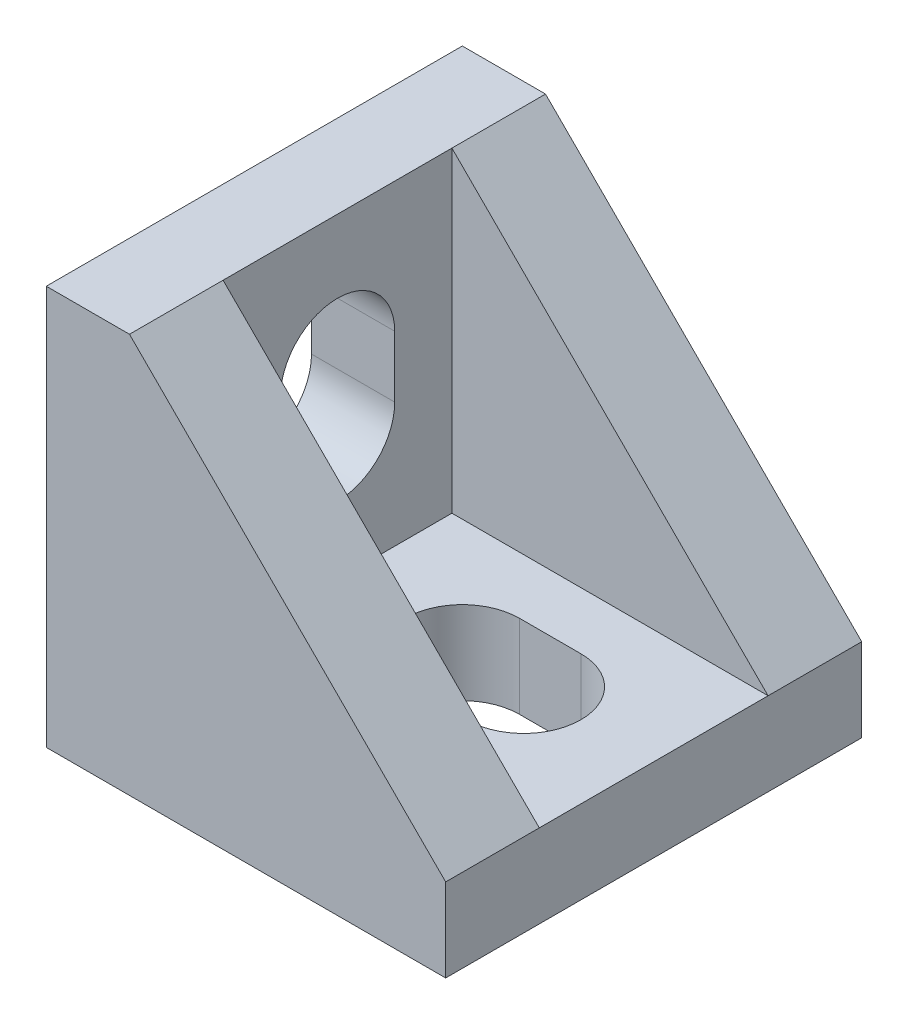
ISO-10303-21;
HEADER;
FILE_DESCRIPTION(('STEP AP214'),'2;1');
FILE_NAME('part.step','',(''),(''),'','','');
FILE_SCHEMA(('AUTOMOTIVE_DESIGN { 1 0 10303 214 1 1 1 1 }'));
ENDSEC;
DATA;
#1=APPLICATION_CONTEXT('core data for automotive mechanical design processes');
#2=APPLICATION_PROTOCOL_DEFINITION('international standard','automotive_design',2000,#1);
#3=PRODUCT_CONTEXT('',#1,'mechanical');
#4=PRODUCT('Part','Part','',(#3));
#5=PRODUCT_RELATED_PRODUCT_CATEGORY('part','',(#4));
#6=PRODUCT_DEFINITION_FORMATION('','',#4);
#7=PRODUCT_DEFINITION_CONTEXT('part definition',#1,'design');
#8=PRODUCT_DEFINITION('design','',#6,#7);
#9=PRODUCT_DEFINITION_SHAPE('','',#8);
#10=(LENGTH_UNIT() NAMED_UNIT(*) SI_UNIT(.MILLI.,.METRE.));
#11=(NAMED_UNIT(*) PLANE_ANGLE_UNIT() SI_UNIT($,.RADIAN.));
#12=(NAMED_UNIT(*) SI_UNIT($,.STERADIAN.) SOLID_ANGLE_UNIT());
#13=UNCERTAINTY_MEASURE_WITH_UNIT(LENGTH_MEASURE(1.E-05),#10,'distance_accuracy_value','');
#14=(GEOMETRIC_REPRESENTATION_CONTEXT(3) GLOBAL_UNCERTAINTY_ASSIGNED_CONTEXT((#13)) GLOBAL_UNIT_ASSIGNED_CONTEXT((#10,
#11,#12)) REPRESENTATION_CONTEXT('',''));
#15=CARTESIAN_POINT('',(0.,0.,0.));
#16=DIRECTION('',(0.,0.,1.));
#17=DIRECTION('',(1.,0.,0.));
#18=AXIS2_PLACEMENT_3D('',#15,#16,#17);
#19=CARTESIAN_POINT('',(0.,0.,4.5));
#20=DIRECTION('',(0.,0.,-1.));
#21=DIRECTION('',(-1.,0.,0.));
#22=AXIS2_PLACEMENT_3D('',#19,#20,#21);
#23=PLANE('',#22);
#24=DIRECTION('',(0.,1.,0.));
#25=VECTOR('',#24,1.);
#26=CARTESIAN_POINT('',(4.,19.2,4.5));
#27=LINE('',#26,#25);
#28=CARTESIAN_POINT('',(4.,4.,4.5));
#29=VERTEX_POINT('',#28);
#30=CARTESIAN_POINT('',(4.,19.2,4.5));
#31=VERTEX_POINT('',#30);
#32=EDGE_CURVE('E11',#29,#31,#27,.T.);
#33=ORIENTED_EDGE('',*,*,#32,.F.);
#34=DIRECTION('',(1.,0.,0.));
#35=VECTOR('',#34,1.);
#36=CARTESIAN_POINT('',(19.2,3.99999999999999,4.5));
#37=LINE('',#36,#35);
#38=CARTESIAN_POINT('',(19.2,3.99999999999999,4.5));
#39=VERTEX_POINT('',#38);
#40=EDGE_CURVE('E199',#29,#39,#37,.T.);
#41=ORIENTED_EDGE('',*,*,#40,.T.);
#42=DIRECTION('',(-0.707106781186547,0.707106781186548,0.));
#43=VECTOR('',#42,1.);
#44=CARTESIAN_POINT('',(4.,19.2,4.5));
#45=LINE('',#44,#43);
#46=EDGE_CURVE('E267',#39,#31,#45,.T.);
#47=ORIENTED_EDGE('',*,*,#46,.T.);
#48=EDGE_LOOP('',(#33,#41,#47));
#49=FACE_BOUND('',#48,.T.);
#50=ADVANCED_FACE('F39',(#49),#23,.F.);
#51=CARTESIAN_POINT('',(4.,19.2,4.5));
#52=DIRECTION('',(-0.707106781186548,-0.707106781186547,0.));
#53=DIRECTION('',(0.707106781186547,-0.707106781186548,0.));
#54=AXIS2_PLACEMENT_3D('',#51,#52,#53);
#55=PLANE('',#54);
#56=DIRECTION('',(-0.707106781186547,0.707106781186548,0.));
#57=VECTOR('',#56,1.);
#58=CARTESIAN_POINT('',(4.,19.2,0.));
#59=LINE('',#58,#57);
#60=CARTESIAN_POINT('',(19.2,3.99999999999999,0.));
#61=VERTEX_POINT('',#60);
#62=CARTESIAN_POINT('',(4.,19.2,0.));
#63=VERTEX_POINT('',#62);
#64=EDGE_CURVE('E266',#61,#63,#59,.T.);
#65=ORIENTED_EDGE('',*,*,#64,.T.);
#66=DIRECTION('',(0.,0.,-1.));
#67=VECTOR('',#66,1.);
#68=CARTESIAN_POINT('',(4.,19.2,4.5));
#69=LINE('',#68,#67);
#70=EDGE_CURVE('E43',#31,#63,#69,.T.);
#71=ORIENTED_EDGE('',*,*,#70,.F.);
#72=ORIENTED_EDGE('',*,*,#46,.F.);
#73=DIRECTION('',(0.,0.,-1.));
#74=VECTOR('',#73,1.);
#75=CARTESIAN_POINT('',(19.2,3.99999999999999,4.5));
#76=LINE('',#75,#74);
#77=EDGE_CURVE('E187',#39,#61,#76,.T.);
#78=ORIENTED_EDGE('',*,*,#77,.T.);
#79=EDGE_LOOP('',(#65,#71,#72,#78));
#80=FACE_BOUND('',#79,.T.);
#81=ADVANCED_FACE('F41',(#80),#55,.F.);
#82=CARTESIAN_POINT('',(0.,19.2,4.5));
#83=DIRECTION('',(0.,-1.,0.));
#84=DIRECTION('',(0.,0.,-1.));
#85=AXIS2_PLACEMENT_3D('',#82,#83,#84);
#86=PLANE('',#85);
#87=DIRECTION('',(-1.,0.,0.));
#88=VECTOR('',#87,1.);
#89=CARTESIAN_POINT('',(0.,19.2,0.));
#90=LINE('',#89,#88);
#91=CARTESIAN_POINT('',(0.,19.2,0.));
#92=VERTEX_POINT('',#91);
#93=EDGE_CURVE('E273',#63,#92,#90,.T.);
#94=ORIENTED_EDGE('',*,*,#93,.T.);
#95=DIRECTION('',(0.,0.,-1.));
#96=VECTOR('',#95,1.);
#97=CARTESIAN_POINT('',(0.,19.2,4.5));
#98=LINE('',#97,#96);
#99=CARTESIAN_POINT('',(0.,19.2,20.));
#100=VERTEX_POINT('',#99);
#101=EDGE_CURVE('E270',#100,#92,#98,.T.);
#102=ORIENTED_EDGE('',*,*,#101,.F.);
#103=DIRECTION('',(-1.,0.,0.));
#104=VECTOR('',#103,1.);
#105=CARTESIAN_POINT('',(0.,19.2,20.));
#106=LINE('',#105,#104);
#107=CARTESIAN_POINT('',(4.,19.2,20.));
#108=VERTEX_POINT('',#107);
#109=EDGE_CURVE('E240',#108,#100,#106,.T.);
#110=ORIENTED_EDGE('',*,*,#109,.F.);
#111=DIRECTION('',(0.,0.,1.));
#112=VECTOR('',#111,1.);
#113=CARTESIAN_POINT('',(4.,19.2,15.5));
#114=LINE('',#113,#112);
#115=CARTESIAN_POINT('',(4.,19.2,15.5));
#116=VERTEX_POINT('',#115);
#117=EDGE_CURVE('E162',#116,#108,#114,.T.);
#118=ORIENTED_EDGE('',*,*,#117,.F.);
#119=DIRECTION('',(0.,0.,1.));
#120=VECTOR('',#119,1.);
#121=CARTESIAN_POINT('',(4.,19.2,4.5));
#122=LINE('',#121,#120);
#123=EDGE_CURVE('E246',#31,#116,#122,.T.);
#124=ORIENTED_EDGE('',*,*,#123,.F.);
#125=ORIENTED_EDGE('',*,*,#70,.T.);
#126=EDGE_LOOP('',(#94,#102,#110,#118,#124,#125));
#127=FACE_BOUND('',#126,.T.);
#128=ADVANCED_FACE('F283',(#127),#86,.F.);
#129=CARTESIAN_POINT('',(0.,0.,4.5));
#130=DIRECTION('',(1.,0.,0.));
#131=DIRECTION('',(0.,0.,-1.));
#132=AXIS2_PLACEMENT_3D('',#129,#130,#131);
#133=PLANE('',#132);
#134=DIRECTION('',(0.,0.,-1.));
#135=VECTOR('',#134,1.);
#136=CARTESIAN_POINT('',(0.,0.,10.));
#137=LINE('',#136,#135);
#138=CARTESIAN_POINT('',(0.,0.,20.));
#139=VERTEX_POINT('',#138);
#140=CARTESIAN_POINT('',(0.,0.,0.));
#141=VERTEX_POINT('',#140);
#142=EDGE_CURVE('E62',#139,#141,#137,.T.);
#143=ORIENTED_EDGE('',*,*,#142,.F.);
#144=DIRECTION('',(0.,-1.,0.));
#145=VECTOR('',#144,1.);
#146=CARTESIAN_POINT('',(0.,0.,20.));
#147=LINE('',#146,#145);
#148=EDGE_CURVE('E163',#100,#139,#147,.T.);
#149=ORIENTED_EDGE('',*,*,#148,.F.);
#150=ORIENTED_EDGE('',*,*,#101,.T.);
#151=DIRECTION('',(0.,-1.,0.));
#152=VECTOR('',#151,1.);
#153=CARTESIAN_POINT('',(0.,0.,0.));
#154=LINE('',#153,#152);
#155=EDGE_CURVE('E271',#92,#141,#154,.T.);
#156=ORIENTED_EDGE('',*,*,#155,.T.);
#157=EDGE_LOOP('',(#143,#149,#150,#156));
#158=FACE_BOUND('',#157,.T.);
#159=CARTESIAN_POINT('',(0.,12.95,10.));
#160=DIRECTION('',(-1.,0.,0.));
#161=DIRECTION('',(0.,0.,1.));
#162=AXIS2_PLACEMENT_3D('',#159,#160,#161);
#163=CIRCLE('',#162,2.75);
#164=CARTESIAN_POINT('',(0.,12.95,12.75));
#165=VERTEX_POINT('',#164);
#166=CARTESIAN_POINT('',(0.,12.95,7.25));
#167=VERTEX_POINT('',#166);
#168=EDGE_CURVE('E227',#165,#167,#163,.T.);
#169=ORIENTED_EDGE('',*,*,#168,.F.);
#170=DIRECTION('',(0.,-1.,0.));
#171=VECTOR('',#170,1.);
#172=CARTESIAN_POINT('',(0.,12.95,12.75));
#173=LINE('',#172,#171);
#174=CARTESIAN_POINT('',(0.,10.,12.75));
#175=VERTEX_POINT('',#174);
#176=EDGE_CURVE('E225',#165,#175,#173,.T.);
#177=ORIENTED_EDGE('',*,*,#176,.T.);
#178=CARTESIAN_POINT('',(0.,10.,9.99999999999999));
#179=DIRECTION('',(-1.,0.,0.));
#180=DIRECTION('',(0.,0.,-1.));
#181=AXIS2_PLACEMENT_3D('',#178,#179,#180);
#182=CIRCLE('',#181,2.75);
#183=CARTESIAN_POINT('',(0.,10.,7.25));
#184=VERTEX_POINT('',#183);
#185=EDGE_CURVE('E258',#184,#175,#182,.T.);
#186=ORIENTED_EDGE('',*,*,#185,.F.);
#187=DIRECTION('',(0.,-1.,0.));
#188=VECTOR('',#187,1.);
#189=CARTESIAN_POINT('',(0.,12.95,7.25));
#190=LINE('',#189,#188);
#191=EDGE_CURVE('E256',#167,#184,#190,.T.);
#192=ORIENTED_EDGE('',*,*,#191,.F.);
#193=EDGE_LOOP('',(#169,#177,#186,#192));
#194=FACE_BOUND('',#193,.T.);
#195=ADVANCED_FACE('F288',(#158,#194),#133,.F.);
#196=CARTESIAN_POINT('',(0.,0.,0.));
#197=DIRECTION('',(0.,0.,-1.));
#198=DIRECTION('',(-1.,0.,0.));
#199=AXIS2_PLACEMENT_3D('',#196,#197,#198);
#200=PLANE('',#199);
#201=ORIENTED_EDGE('',*,*,#64,.F.);
#202=DIRECTION('',(0.,-1.,0.));
#203=VECTOR('',#202,1.);
#204=CARTESIAN_POINT('',(19.2,0.,0.));
#205=LINE('',#204,#203);
#206=CARTESIAN_POINT('',(19.2,0.,0.));
#207=VERTEX_POINT('',#206);
#208=EDGE_CURVE('E214',#61,#207,#205,.T.);
#209=ORIENTED_EDGE('',*,*,#208,.T.);
#210=DIRECTION('',(-1.,0.,0.));
#211=VECTOR('',#210,1.);
#212=CARTESIAN_POINT('',(0.,0.,0.));
#213=LINE('',#212,#211);
#214=EDGE_CURVE('E217',#207,#141,#213,.T.);
#215=ORIENTED_EDGE('',*,*,#214,.T.);
#216=ORIENTED_EDGE('',*,*,#155,.F.);
#217=ORIENTED_EDGE('',*,*,#93,.F.);
#218=EDGE_LOOP('',(#201,#209,#215,#216,#217));
#219=FACE_BOUND('',#218,.T.);
#220=ADVANCED_FACE('F287',(#219),#200,.T.);
#221=CARTESIAN_POINT('',(4.,12.95,10.));
#222=DIRECTION('',(-1.,0.,0.));
#223=DIRECTION('',(0.,0.,1.));
#224=AXIS2_PLACEMENT_3D('',#221,#222,#223);
#225=CYLINDRICAL_SURFACE('',#224,2.75);
#226=ORIENTED_EDGE('',*,*,#168,.T.);
#227=DIRECTION('',(-1.,0.,0.));
#228=VECTOR('',#227,1.);
#229=CARTESIAN_POINT('',(4.,12.95,7.25));
#230=LINE('',#229,#228);
#231=CARTESIAN_POINT('',(4.,12.95,7.25));
#232=VERTEX_POINT('',#231);
#233=EDGE_CURVE('E263',#232,#167,#230,.T.);
#234=ORIENTED_EDGE('',*,*,#233,.F.);
#235=CARTESIAN_POINT('',(4.,12.95,10.));
#236=DIRECTION('',(-1.,0.,0.));
#237=DIRECTION('',(0.,0.,1.));
#238=AXIS2_PLACEMENT_3D('',#235,#236,#237);
#239=CIRCLE('',#238,2.75);
#240=CARTESIAN_POINT('',(4.,12.95,12.75));
#241=VERTEX_POINT('',#240);
#242=EDGE_CURVE('E248',#241,#232,#239,.T.);
#243=ORIENTED_EDGE('',*,*,#242,.F.);
#244=DIRECTION('',(-1.,0.,0.));
#245=VECTOR('',#244,1.);
#246=CARTESIAN_POINT('',(4.,12.95,12.75));
#247=LINE('',#246,#245);
#248=EDGE_CURVE('E236',#241,#165,#247,.T.);
#249=ORIENTED_EDGE('',*,*,#248,.T.);
#250=EDGE_LOOP('',(#226,#234,#243,#249));
#251=FACE_BOUND('',#250,.T.);
#252=ADVANCED_FACE('F347',(#251),#225,.F.);
#253=CARTESIAN_POINT('',(4.,12.95,7.25));
#254=DIRECTION('',(0.,0.,-1.));
#255=DIRECTION('',(0.,1.,0.));
#256=AXIS2_PLACEMENT_3D('',#253,#254,#255);
#257=PLANE('',#256);
#258=ORIENTED_EDGE('',*,*,#191,.T.);
#259=DIRECTION('',(-1.,0.,0.));
#260=VECTOR('',#259,1.);
#261=CARTESIAN_POINT('',(4.,10.,7.25));
#262=LINE('',#261,#260);
#263=CARTESIAN_POINT('',(4.,10.,7.25));
#264=VERTEX_POINT('',#263);
#265=EDGE_CURVE('E254',#264,#184,#262,.T.);
#266=ORIENTED_EDGE('',*,*,#265,.F.);
#267=DIRECTION('',(0.,-1.,0.));
#268=VECTOR('',#267,1.);
#269=CARTESIAN_POINT('',(4.,12.95,7.25));
#270=LINE('',#269,#268);
#271=EDGE_CURVE('E250',#232,#264,#270,.T.);
#272=ORIENTED_EDGE('',*,*,#271,.F.);
#273=ORIENTED_EDGE('',*,*,#233,.T.);
#274=EDGE_LOOP('',(#258,#266,#272,#273));
#275=FACE_BOUND('',#274,.T.);
#276=ADVANCED_FACE('F335',(#275),#257,.F.);
#277=CARTESIAN_POINT('',(4.,10.,9.99999999999999));
#278=DIRECTION('',(-1.,0.,0.));
#279=DIRECTION('',(0.,0.,1.));
#280=AXIS2_PLACEMENT_3D('',#277,#278,#279);
#281=CYLINDRICAL_SURFACE('',#280,2.75);
#282=ORIENTED_EDGE('',*,*,#185,.T.);
#283=DIRECTION('',(-1.,0.,0.));
#284=VECTOR('',#283,1.);
#285=CARTESIAN_POINT('',(4.,10.,12.75));
#286=LINE('',#285,#284);
#287=CARTESIAN_POINT('',(4.,10.,12.75));
#288=VERTEX_POINT('',#287);
#289=EDGE_CURVE('E231',#288,#175,#286,.T.);
#290=ORIENTED_EDGE('',*,*,#289,.F.);
#291=CARTESIAN_POINT('',(4.,10.,9.99999999999999));
#292=DIRECTION('',(-1.,0.,0.));
#293=DIRECTION('',(0.,0.,-1.));
#294=AXIS2_PLACEMENT_3D('',#291,#292,#293);
#295=CIRCLE('',#294,2.75);
#296=EDGE_CURVE('E252',#264,#288,#295,.T.);
#297=ORIENTED_EDGE('',*,*,#296,.F.);
#298=ORIENTED_EDGE('',*,*,#265,.T.);
#299=EDGE_LOOP('',(#282,#290,#297,#298));
#300=FACE_BOUND('',#299,.T.);
#301=ADVANCED_FACE('F327',(#300),#281,.F.);
#302=CARTESIAN_POINT('',(4.,0.,10.));
#303=DIRECTION('',(0.,1.,0.));
#304=DIRECTION('',(0.,0.,1.));
#305=AXIS2_PLACEMENT_3D('',#302,#303,#304);
#306=PLANE('',#305);
#307=ORIENTED_EDGE('',*,*,#142,.T.);
#308=ORIENTED_EDGE('',*,*,#214,.F.);
#309=DIRECTION('',(0.,0.,-1.));
#310=VECTOR('',#309,1.);
#311=CARTESIAN_POINT('',(19.2,0.,4.5));
#312=LINE('',#311,#310);
#313=CARTESIAN_POINT('',(19.2,0.,20.));
#314=VERTEX_POINT('',#313);
#315=EDGE_CURVE('E220',#314,#207,#312,.T.);
#316=ORIENTED_EDGE('',*,*,#315,.F.);
#317=DIRECTION('',(-1.,0.,0.));
#318=VECTOR('',#317,1.);
#319=CARTESIAN_POINT('',(0.,0.,20.));
#320=LINE('',#319,#318);
#321=EDGE_CURVE('E182',#314,#139,#320,.T.);
#322=ORIENTED_EDGE('',*,*,#321,.T.);
#323=EDGE_LOOP('',(#307,#308,#316,#322));
#324=FACE_BOUND('',#323,.T.);
#325=CARTESIAN_POINT('',(12.95,0.,10.));
#326=DIRECTION('',(0.,1.,0.));
#327=DIRECTION('',(0.,0.,1.));
#328=AXIS2_PLACEMENT_3D('',#325,#326,#327);
#329=CIRCLE('',#328,2.75);
#330=CARTESIAN_POINT('',(12.95,0.,12.75));
#331=VERTEX_POINT('',#330);
#332=CARTESIAN_POINT('',(12.95,0.,7.25));
#333=VERTEX_POINT('',#332);
#334=EDGE_CURVE('E172',#331,#333,#329,.T.);
#335=ORIENTED_EDGE('',*,*,#334,.T.);
#336=DIRECTION('',(-1.,0.,0.));
#337=VECTOR('',#336,1.);
#338=CARTESIAN_POINT('',(12.95,0.,7.25));
#339=LINE('',#338,#337);
#340=CARTESIAN_POINT('',(10.,0.,7.25));
#341=VERTEX_POINT('',#340);
#342=EDGE_CURVE('E196',#333,#341,#339,.T.);
#343=ORIENTED_EDGE('',*,*,#342,.T.);
#344=CARTESIAN_POINT('',(10.,0.,9.99999999999999));
#345=DIRECTION('',(0.,1.,0.));
#346=DIRECTION('',(0.,0.,-1.));
#347=AXIS2_PLACEMENT_3D('',#344,#345,#346);
#348=CIRCLE('',#347,2.75);
#349=CARTESIAN_POINT('',(10.,0.,12.75));
#350=VERTEX_POINT('',#349);
#351=EDGE_CURVE('E190',#341,#350,#348,.T.);
#352=ORIENTED_EDGE('',*,*,#351,.T.);
#353=DIRECTION('',(-1.,0.,0.));
#354=VECTOR('',#353,1.);
#355=CARTESIAN_POINT('',(12.95,0.,12.75));
#356=LINE('',#355,#354);
#357=EDGE_CURVE('E304',#331,#350,#356,.T.);
#358=ORIENTED_EDGE('',*,*,#357,.F.);
#359=EDGE_LOOP('',(#335,#343,#352,#358));
#360=FACE_BOUND('',#359,.T.);
#361=ADVANCED_FACE('F293',(#324,#360),#306,.F.);
#362=CARTESIAN_POINT('',(4.,10.,9.99999999999999));
#363=DIRECTION('',(1.,0.,0.));
#364=DIRECTION('',(0.,0.,-1.));
#365=AXIS2_PLACEMENT_3D('',#362,#363,#364);
#366=PLANE('',#365);
#367=DIRECTION('',(0.,0.,1.));
#368=VECTOR('',#367,1.);
#369=CARTESIAN_POINT('',(4.,4.,9.99999999999999));
#370=LINE('',#369,#368);
#371=CARTESIAN_POINT('',(4.,4.,15.5));
#372=VERTEX_POINT('',#371);
#373=EDGE_CURVE('E54',#29,#372,#370,.T.);
#374=ORIENTED_EDGE('',*,*,#373,.F.);
#375=ORIENTED_EDGE('',*,*,#32,.T.);
#376=ORIENTED_EDGE('',*,*,#123,.T.);
#377=DIRECTION('',(0.,1.,0.));
#378=VECTOR('',#377,1.);
#379=CARTESIAN_POINT('',(4.,19.2,15.5));
#380=LINE('',#379,#378);
#381=EDGE_CURVE('E158',#372,#116,#380,.T.);
#382=ORIENTED_EDGE('',*,*,#381,.F.);
#383=EDGE_LOOP('',(#374,#375,#376,#382));
#384=FACE_BOUND('',#383,.T.);
#385=DIRECTION('',(0.,-1.,0.));
#386=VECTOR('',#385,1.);
#387=CARTESIAN_POINT('',(4.,12.95,12.75));
#388=LINE('',#387,#386);
#389=EDGE_CURVE('E228',#241,#288,#388,.T.);
#390=ORIENTED_EDGE('',*,*,#389,.F.);
#391=ORIENTED_EDGE('',*,*,#242,.T.);
#392=ORIENTED_EDGE('',*,*,#271,.T.);
#393=ORIENTED_EDGE('',*,*,#296,.T.);
#394=EDGE_LOOP('',(#390,#391,#392,#393));
#395=FACE_BOUND('',#394,.T.);
#396=ADVANCED_FACE('F326',(#384,#395),#366,.T.);
#397=CARTESIAN_POINT('',(0.,0.,15.5));
#398=DIRECTION('',(0.,0.,1.));
#399=DIRECTION('',(-1.,0.,0.));
#400=AXIS2_PLACEMENT_3D('',#397,#398,#399);
#401=PLANE('',#400);
#402=ORIENTED_EDGE('',*,*,#381,.T.);
#403=DIRECTION('',(-0.707106781186547,0.707106781186548,0.));
#404=VECTOR('',#403,1.);
#405=CARTESIAN_POINT('',(4.,19.2,15.5));
#406=LINE('',#405,#404);
#407=CARTESIAN_POINT('',(19.2,3.99999999999999,15.5));
#408=VERTEX_POINT('',#407);
#409=EDGE_CURVE('E154',#408,#116,#406,.T.);
#410=ORIENTED_EDGE('',*,*,#409,.F.);
#411=DIRECTION('',(1.,0.,0.));
#412=VECTOR('',#411,1.);
#413=CARTESIAN_POINT('',(19.2,3.99999999999999,15.5));
#414=LINE('',#413,#412);
#415=EDGE_CURVE('E157',#372,#408,#414,.T.);
#416=ORIENTED_EDGE('',*,*,#415,.F.);
#417=EDGE_LOOP('',(#402,#410,#416));
#418=FACE_BOUND('',#417,.T.);
#419=ADVANCED_FACE('F156',(#418),#401,.F.);
#420=CARTESIAN_POINT('',(4.,19.2,15.5));
#421=DIRECTION('',(-0.707106781186548,-0.707106781186547,0.));
#422=DIRECTION('',(0.707106781186547,-0.707106781186548,0.));
#423=AXIS2_PLACEMENT_3D('',#420,#421,#422);
#424=PLANE('',#423);
#425=DIRECTION('',(-0.707106781186547,0.707106781186548,0.));
#426=VECTOR('',#425,1.);
#427=CARTESIAN_POINT('',(4.,19.2,20.));
#428=LINE('',#427,#426);
#429=CARTESIAN_POINT('',(19.2,3.99999999999999,20.));
#430=VERTEX_POINT('',#429);
#431=EDGE_CURVE('E178',#430,#108,#428,.T.);
#432=ORIENTED_EDGE('',*,*,#431,.F.);
#433=DIRECTION('',(0.,0.,1.));
#434=VECTOR('',#433,1.);
#435=CARTESIAN_POINT('',(19.2,3.99999999999999,15.5));
#436=LINE('',#435,#434);
#437=EDGE_CURVE('E173',#408,#430,#436,.T.);
#438=ORIENTED_EDGE('',*,*,#437,.F.);
#439=ORIENTED_EDGE('',*,*,#409,.T.);
#440=ORIENTED_EDGE('',*,*,#117,.T.);
#441=EDGE_LOOP('',(#432,#438,#439,#440));
#442=FACE_BOUND('',#441,.T.);
#443=ADVANCED_FACE('F176',(#442),#424,.F.);
#444=CARTESIAN_POINT('',(0.,0.,20.));
#445=DIRECTION('',(0.,0.,1.));
#446=DIRECTION('',(-1.,0.,0.));
#447=AXIS2_PLACEMENT_3D('',#444,#445,#446);
#448=PLANE('',#447);
#449=ORIENTED_EDGE('',*,*,#148,.T.);
#450=ORIENTED_EDGE('',*,*,#321,.F.);
#451=DIRECTION('',(0.,-1.,0.));
#452=VECTOR('',#451,1.);
#453=CARTESIAN_POINT('',(19.2,0.,20.));
#454=LINE('',#453,#452);
#455=EDGE_CURVE('E295',#430,#314,#454,.T.);
#456=ORIENTED_EDGE('',*,*,#455,.F.);
#457=ORIENTED_EDGE('',*,*,#431,.T.);
#458=ORIENTED_EDGE('',*,*,#109,.T.);
#459=EDGE_LOOP('',(#449,#450,#456,#457,#458));
#460=FACE_BOUND('',#459,.T.);
#461=ADVANCED_FACE('F291',(#460),#448,.T.);
#462=CARTESIAN_POINT('',(4.,12.95,12.75));
#463=DIRECTION('',(0.,0.,1.));
#464=DIRECTION('',(0.,1.,0.));
#465=AXIS2_PLACEMENT_3D('',#462,#463,#464);
#466=PLANE('',#465);
#467=ORIENTED_EDGE('',*,*,#176,.F.);
#468=ORIENTED_EDGE('',*,*,#248,.F.);
#469=ORIENTED_EDGE('',*,*,#389,.T.);
#470=ORIENTED_EDGE('',*,*,#289,.T.);
#471=EDGE_LOOP('',(#467,#468,#469,#470));
#472=FACE_BOUND('',#471,.T.);
#473=ADVANCED_FACE('F411',(#472),#466,.F.);
#474=CARTESIAN_POINT('',(19.2,0.,4.5));
#475=DIRECTION('',(-1.,0.,0.));
#476=DIRECTION('',(0.,0.,-1.));
#477=AXIS2_PLACEMENT_3D('',#474,#475,#476);
#478=PLANE('',#477);
#479=ORIENTED_EDGE('',*,*,#208,.F.);
#480=ORIENTED_EDGE('',*,*,#77,.F.);
#481=DIRECTION('',(0.,0.,1.));
#482=VECTOR('',#481,1.);
#483=CARTESIAN_POINT('',(19.2,3.99999999999999,4.5));
#484=LINE('',#483,#482);
#485=EDGE_CURVE('E170',#39,#408,#484,.T.);
#486=ORIENTED_EDGE('',*,*,#485,.T.);
#487=ORIENTED_EDGE('',*,*,#437,.T.);
#488=ORIENTED_EDGE('',*,*,#455,.T.);
#489=ORIENTED_EDGE('',*,*,#315,.T.);
#490=EDGE_LOOP('',(#479,#480,#486,#487,#488,#489));
#491=FACE_BOUND('',#490,.T.);
#492=ADVANCED_FACE('F185',(#491),#478,.F.);
#493=CARTESIAN_POINT('',(12.95,3.99999999999999,10.));
#494=DIRECTION('',(0.,-1.,0.));
#495=DIRECTION('',(0.,0.,1.));
#496=AXIS2_PLACEMENT_3D('',#493,#494,#495);
#497=CYLINDRICAL_SURFACE('',#496,2.75);
#498=ORIENTED_EDGE('',*,*,#334,.F.);
#499=DIRECTION('',(0.,-1.,0.));
#500=VECTOR('',#499,1.);
#501=CARTESIAN_POINT('',(12.95,3.99999999999999,12.75));
#502=LINE('',#501,#500);
#503=CARTESIAN_POINT('',(12.95,3.99999999999999,12.75));
#504=VERTEX_POINT('',#503);
#505=EDGE_CURVE('E297',#504,#331,#502,.T.);
#506=ORIENTED_EDGE('',*,*,#505,.F.);
#507=CARTESIAN_POINT('',(12.95,3.99999999999999,10.));
#508=DIRECTION('',(0.,1.,0.));
#509=DIRECTION('',(0.,0.,1.));
#510=AXIS2_PLACEMENT_3D('',#507,#508,#509);
#511=CIRCLE('',#510,2.75);
#512=CARTESIAN_POINT('',(12.95,3.99999999999999,7.25));
#513=VERTEX_POINT('',#512);
#514=EDGE_CURVE('E189',#504,#513,#511,.T.);
#515=ORIENTED_EDGE('',*,*,#514,.T.);
#516=DIRECTION('',(0.,-1.,0.));
#517=VECTOR('',#516,1.);
#518=CARTESIAN_POINT('',(12.95,3.99999999999999,7.25));
#519=LINE('',#518,#517);
#520=EDGE_CURVE('E212',#513,#333,#519,.T.);
#521=ORIENTED_EDGE('',*,*,#520,.T.);
#522=EDGE_LOOP('',(#498,#506,#515,#521));
#523=FACE_BOUND('',#522,.T.);
#524=ADVANCED_FACE('F324',(#523),#497,.F.);
#525=CARTESIAN_POINT('',(12.95,3.99999999999999,7.25));
#526=DIRECTION('',(0.,0.,-1.));
#527=DIRECTION('',(1.,0.,0.));
#528=AXIS2_PLACEMENT_3D('',#525,#526,#527);
#529=PLANE('',#528);
#530=ORIENTED_EDGE('',*,*,#342,.F.);
#531=ORIENTED_EDGE('',*,*,#520,.F.);
#532=DIRECTION('',(-1.,0.,0.));
#533=VECTOR('',#532,1.);
#534=CARTESIAN_POINT('',(12.95,3.99999999999999,7.25));
#535=LINE('',#534,#533);
#536=CARTESIAN_POINT('',(10.,4.,7.25));
#537=VERTEX_POINT('',#536);
#538=EDGE_CURVE('E193',#513,#537,#535,.T.);
#539=ORIENTED_EDGE('',*,*,#538,.T.);
#540=DIRECTION('',(0.,-1.,0.));
#541=VECTOR('',#540,1.);
#542=CARTESIAN_POINT('',(10.,4.,7.25));
#543=LINE('',#542,#541);
#544=EDGE_CURVE('E206',#537,#341,#543,.T.);
#545=ORIENTED_EDGE('',*,*,#544,.T.);
#546=EDGE_LOOP('',(#530,#531,#539,#545));
#547=FACE_BOUND('',#546,.T.);
#548=ADVANCED_FACE('F321',(#547),#529,.F.);
#549=CARTESIAN_POINT('',(10.,4.,9.99999999999999));
#550=DIRECTION('',(0.,-1.,0.));
#551=DIRECTION('',(0.,0.,1.));
#552=AXIS2_PLACEMENT_3D('',#549,#550,#551);
#553=CYLINDRICAL_SURFACE('',#552,2.75);
#554=ORIENTED_EDGE('',*,*,#351,.F.);
#555=ORIENTED_EDGE('',*,*,#544,.F.);
#556=CARTESIAN_POINT('',(10.,4.,9.99999999999999));
#557=DIRECTION('',(0.,1.,0.));
#558=DIRECTION('',(0.,0.,-1.));
#559=AXIS2_PLACEMENT_3D('',#556,#557,#558);
#560=CIRCLE('',#559,2.75);
#561=CARTESIAN_POINT('',(10.,4.,12.75));
#562=VERTEX_POINT('',#561);
#563=EDGE_CURVE('E203',#537,#562,#560,.T.);
#564=ORIENTED_EDGE('',*,*,#563,.T.);
#565=DIRECTION('',(0.,-1.,0.));
#566=VECTOR('',#565,1.);
#567=CARTESIAN_POINT('',(10.,4.,12.75));
#568=LINE('',#567,#566);
#569=EDGE_CURVE('E301',#562,#350,#568,.T.);
#570=ORIENTED_EDGE('',*,*,#569,.T.);
#571=EDGE_LOOP('',(#554,#555,#564,#570));
#572=FACE_BOUND('',#571,.T.);
#573=ADVANCED_FACE('F317',(#572),#553,.F.);
#574=CARTESIAN_POINT('',(10.,4.,9.99999999999999));
#575=DIRECTION('',(0.,1.,0.));
#576=DIRECTION('',(0.,0.,-1.));
#577=AXIS2_PLACEMENT_3D('',#574,#575,#576);
#578=PLANE('',#577);
#579=DIRECTION('',(-1.,0.,0.));
#580=VECTOR('',#579,1.);
#581=CARTESIAN_POINT('',(12.95,3.99999999999999,12.75));
#582=LINE('',#581,#580);
#583=EDGE_CURVE('E303',#504,#562,#582,.T.);
#584=ORIENTED_EDGE('',*,*,#583,.T.);
#585=ORIENTED_EDGE('',*,*,#563,.F.);
#586=ORIENTED_EDGE('',*,*,#538,.F.);
#587=ORIENTED_EDGE('',*,*,#514,.F.);
#588=EDGE_LOOP('',(#584,#585,#586,#587));
#589=FACE_BOUND('',#588,.T.);
#590=ORIENTED_EDGE('',*,*,#40,.F.);
#591=ORIENTED_EDGE('',*,*,#373,.T.);
#592=ORIENTED_EDGE('',*,*,#415,.T.);
#593=ORIENTED_EDGE('',*,*,#485,.F.);
#594=EDGE_LOOP('',(#590,#591,#592,#593));
#595=FACE_BOUND('',#594,.T.);
#596=ADVANCED_FACE('F168',(#589,#595),#578,.T.);
#597=CARTESIAN_POINT('',(12.95,3.99999999999999,12.75));
#598=DIRECTION('',(0.,0.,1.));
#599=DIRECTION('',(1.,0.,0.));
#600=AXIS2_PLACEMENT_3D('',#597,#598,#599);
#601=PLANE('',#600);
#602=ORIENTED_EDGE('',*,*,#357,.T.);
#603=ORIENTED_EDGE('',*,*,#569,.F.);
#604=ORIENTED_EDGE('',*,*,#583,.F.);
#605=ORIENTED_EDGE('',*,*,#505,.T.);
#606=EDGE_LOOP('',(#602,#603,#604,#605));
#607=FACE_BOUND('',#606,.T.);
#608=ADVANCED_FACE('F313',(#607),#601,.F.);
#609=CLOSED_SHELL('',(#50,#81,#128,#195,#220,#252,#276,#301,#361,#396,#419,#443,#461,#473,#492,
#524,#548,#573,#596,#608));
#610=MANIFOLD_SOLID_BREP('B2',#609);
#611=ADVANCED_BREP_SHAPE_REPRESENTATION('',(#18,#610),#14);
#612=SHAPE_DEFINITION_REPRESENTATION(#9,#611);
ENDSEC;
END-ISO-10303-21;
